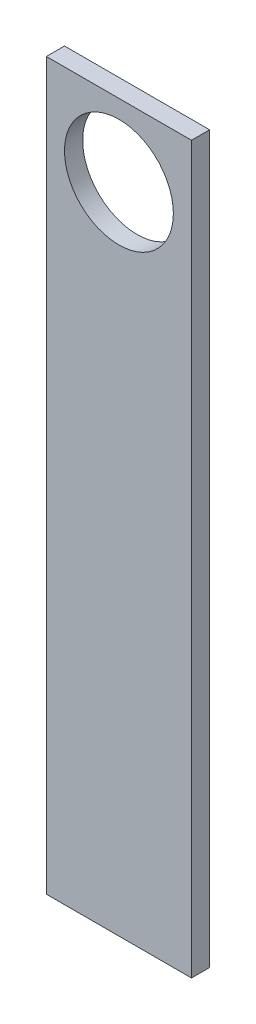
ISO-10303-21;
HEADER;
FILE_DESCRIPTION(('STEP AP214'),'2;1');
FILE_NAME('part.step','',(''),(''),'','','');
FILE_SCHEMA(('AUTOMOTIVE_DESIGN { 1 0 10303 214 1 1 1 1 }'));
ENDSEC;
DATA;
#1=APPLICATION_CONTEXT('core data for automotive mechanical design processes');
#2=APPLICATION_PROTOCOL_DEFINITION('international standard','automotive_design',2000,#1);
#3=PRODUCT_CONTEXT('',#1,'mechanical');
#4=PRODUCT('Part','Part','',(#3));
#5=PRODUCT_RELATED_PRODUCT_CATEGORY('part','',(#4));
#6=PRODUCT_DEFINITION_FORMATION('','',#4);
#7=PRODUCT_DEFINITION_CONTEXT('part definition',#1,'design');
#8=PRODUCT_DEFINITION('design','',#6,#7);
#9=PRODUCT_DEFINITION_SHAPE('','',#8);
#10=(LENGTH_UNIT() NAMED_UNIT(*) SI_UNIT(.MILLI.,.METRE.));
#11=(NAMED_UNIT(*) PLANE_ANGLE_UNIT() SI_UNIT($,.RADIAN.));
#12=(NAMED_UNIT(*) SI_UNIT($,.STERADIAN.) SOLID_ANGLE_UNIT());
#13=UNCERTAINTY_MEASURE_WITH_UNIT(LENGTH_MEASURE(1.E-05),#10,'distance_accuracy_value','');
#14=(GEOMETRIC_REPRESENTATION_CONTEXT(3) GLOBAL_UNCERTAINTY_ASSIGNED_CONTEXT((#13)) GLOBAL_UNIT_ASSIGNED_CONTEXT((#10,
#11,#12)) REPRESENTATION_CONTEXT('',''));
#15=CARTESIAN_POINT('',(0.,0.,0.));
#16=DIRECTION('',(0.,0.,1.));
#17=DIRECTION('',(1.,0.,0.));
#18=AXIS2_PLACEMENT_3D('',#15,#16,#17);
#19=CARTESIAN_POINT('',(-21.2550284629981,17.0136622390892,3.175));
#20=DIRECTION('',(1.,0.,0.));
#21=DIRECTION('',(0.,1.,0.));
#22=AXIS2_PLACEMENT_3D('',#19,#20,#21);
#23=PLANE('',#22);
#24=DIRECTION('',(0.,-1.,0.));
#25=VECTOR('',#24,1.);
#26=CARTESIAN_POINT('',(-21.2550284629981,17.0136622390892,0.));
#27=LINE('',#26,#25);
#28=CARTESIAN_POINT('',(-21.2550284629981,17.0136622390892,0.));
#29=VERTEX_POINT('',#28);
#30=CARTESIAN_POINT('',(-21.2550284629981,-109.986337760911,0.));
#31=VERTEX_POINT('',#30);
#32=EDGE_CURVE('E106',#29,#31,#27,.T.);
#33=ORIENTED_EDGE('',*,*,#32,.T.);
#34=DIRECTION('',(0.,0.,-1.));
#35=VECTOR('',#34,1.);
#36=CARTESIAN_POINT('',(-21.2550284629981,-109.986337760911,3.175));
#37=LINE('',#36,#35);
#38=CARTESIAN_POINT('',(-21.2550284629981,-109.986337760911,3.175));
#39=VERTEX_POINT('',#38);
#40=EDGE_CURVE('E11',#39,#31,#37,.T.);
#41=ORIENTED_EDGE('',*,*,#40,.F.);
#42=DIRECTION('',(0.,-1.,0.));
#43=VECTOR('',#42,1.);
#44=CARTESIAN_POINT('',(-21.2550284629981,17.0136622390892,3.175));
#45=LINE('',#44,#43);
#46=CARTESIAN_POINT('',(-21.2550284629981,17.0136622390892,3.175));
#47=VERTEX_POINT('',#46);
#48=EDGE_CURVE('E90',#47,#39,#45,.T.);
#49=ORIENTED_EDGE('',*,*,#48,.F.);
#50=DIRECTION('',(0.,0.,-1.));
#51=VECTOR('',#50,1.);
#52=CARTESIAN_POINT('',(-21.2550284629981,17.0136622390892,3.175));
#53=LINE('',#52,#51);
#54=EDGE_CURVE('E102',#47,#29,#53,.T.);
#55=ORIENTED_EDGE('',*,*,#54,.T.);
#56=EDGE_LOOP('',(#33,#41,#49,#55));
#57=FACE_BOUND('',#56,.T.);
#58=ADVANCED_FACE('F38',(#57),#23,.F.);
#59=CARTESIAN_POINT('',(-21.2550284629981,-109.986337760911,3.175));
#60=DIRECTION('',(0.,1.,0.));
#61=DIRECTION('',(0.,0.,1.));
#62=AXIS2_PLACEMENT_3D('',#59,#60,#61);
#63=PLANE('',#62);
#64=DIRECTION('',(1.,0.,0.));
#65=VECTOR('',#64,1.);
#66=CARTESIAN_POINT('',(-21.2550284629981,-109.986337760911,0.));
#67=LINE('',#66,#65);
#68=CARTESIAN_POINT('',(4.14497153700191,-109.986337760911,0.));
#69=VERTEX_POINT('',#68);
#70=EDGE_CURVE('E95',#31,#69,#67,.T.);
#71=ORIENTED_EDGE('',*,*,#70,.T.);
#72=DIRECTION('',(0.,0.,-1.));
#73=VECTOR('',#72,1.);
#74=CARTESIAN_POINT('',(4.14497153700191,-109.986337760911,3.175));
#75=LINE('',#74,#73);
#76=CARTESIAN_POINT('',(4.14497153700191,-109.986337760911,3.175));
#77=VERTEX_POINT('',#76);
#78=EDGE_CURVE('E47',#77,#69,#75,.T.);
#79=ORIENTED_EDGE('',*,*,#78,.F.);
#80=DIRECTION('',(1.,0.,0.));
#81=VECTOR('',#80,1.);
#82=CARTESIAN_POINT('',(-21.2550284629981,-109.986337760911,3.175));
#83=LINE('',#82,#81);
#84=EDGE_CURVE('E85',#39,#77,#83,.T.);
#85=ORIENTED_EDGE('',*,*,#84,.F.);
#86=ORIENTED_EDGE('',*,*,#40,.T.);
#87=EDGE_LOOP('',(#71,#79,#85,#86));
#88=FACE_BOUND('',#87,.T.);
#89=ADVANCED_FACE('F94',(#88),#63,.F.);
#90=CARTESIAN_POINT('',(4.1449715370019,17.0136622390892,3.175));
#91=DIRECTION('',(-1.,0.,0.));
#92=DIRECTION('',(0.,-1.,0.));
#93=AXIS2_PLACEMENT_3D('',#90,#91,#92);
#94=PLANE('',#93);
#95=DIRECTION('',(0.,1.,0.));
#96=VECTOR('',#95,1.);
#97=CARTESIAN_POINT('',(4.1449715370019,17.0136622390892,0.));
#98=LINE('',#97,#96);
#99=CARTESIAN_POINT('',(4.1449715370019,17.0136622390892,0.));
#100=VERTEX_POINT('',#99);
#101=EDGE_CURVE('E72',#69,#100,#98,.T.);
#102=ORIENTED_EDGE('',*,*,#101,.T.);
#103=DIRECTION('',(0.,0.,-1.));
#104=VECTOR('',#103,1.);
#105=CARTESIAN_POINT('',(4.1449715370019,17.0136622390892,3.175));
#106=LINE('',#105,#104);
#107=CARTESIAN_POINT('',(4.1449715370019,17.0136622390892,3.175));
#108=VERTEX_POINT('',#107);
#109=EDGE_CURVE('E97',#108,#100,#106,.T.);
#110=ORIENTED_EDGE('',*,*,#109,.F.);
#111=DIRECTION('',(0.,1.,0.));
#112=VECTOR('',#111,1.);
#113=CARTESIAN_POINT('',(4.1449715370019,17.0136622390892,3.175));
#114=LINE('',#113,#112);
#115=EDGE_CURVE('E88',#77,#108,#114,.T.);
#116=ORIENTED_EDGE('',*,*,#115,.F.);
#117=ORIENTED_EDGE('',*,*,#78,.T.);
#118=EDGE_LOOP('',(#102,#110,#116,#117));
#119=FACE_BOUND('',#118,.T.);
#120=ADVANCED_FACE('F98',(#119),#94,.F.);
#121=CARTESIAN_POINT('',(-21.2550284629981,17.0136622390892,3.175));
#122=DIRECTION('',(0.,-1.,0.));
#123=DIRECTION('',(0.,0.,-1.));
#124=AXIS2_PLACEMENT_3D('',#121,#122,#123);
#125=PLANE('',#124);
#126=DIRECTION('',(-1.,0.,0.));
#127=VECTOR('',#126,1.);
#128=CARTESIAN_POINT('',(-21.2550284629981,17.0136622390892,0.));
#129=LINE('',#128,#127);
#130=EDGE_CURVE('E78',#100,#29,#129,.T.);
#131=ORIENTED_EDGE('',*,*,#130,.T.);
#132=ORIENTED_EDGE('',*,*,#54,.F.);
#133=DIRECTION('',(-1.,0.,0.));
#134=VECTOR('',#133,1.);
#135=CARTESIAN_POINT('',(-21.2550284629981,17.0136622390892,3.175));
#136=LINE('',#135,#134);
#137=EDGE_CURVE('E55',#108,#47,#136,.T.);
#138=ORIENTED_EDGE('',*,*,#137,.F.);
#139=ORIENTED_EDGE('',*,*,#109,.T.);
#140=EDGE_LOOP('',(#131,#132,#138,#139));
#141=FACE_BOUND('',#140,.T.);
#142=ADVANCED_FACE('F120',(#141),#125,.F.);
#143=CARTESIAN_POINT('',(0.,0.,3.175));
#144=DIRECTION('',(0.,0.,1.));
#145=DIRECTION('',(1.,0.,0.));
#146=AXIS2_PLACEMENT_3D('',#143,#144,#145);
#147=PLANE('',#146);
#148=CARTESIAN_POINT('',(-8.5550284629981,4.31366223908918,3.175));
#149=DIRECTION('',(0.,0.,1.));
#150=DIRECTION('',(1.,0.,0.));
#151=AXIS2_PLACEMENT_3D('',#148,#149,#150);
#152=CIRCLE('',#151,9.525);
#153=CARTESIAN_POINT('',(0.969971537001896,4.31366223908918,3.175));
#154=VERTEX_POINT('',#153);
#155=EDGE_CURVE('E127',#154,#154,#152,.T.);
#156=ORIENTED_EDGE('',*,*,#155,.F.);
#157=EDGE_LOOP('',(#156));
#158=FACE_BOUND('',#157,.T.);
#159=ORIENTED_EDGE('',*,*,#48,.T.);
#160=ORIENTED_EDGE('',*,*,#84,.T.);
#161=ORIENTED_EDGE('',*,*,#115,.T.);
#162=ORIENTED_EDGE('',*,*,#137,.T.);
#163=EDGE_LOOP('',(#159,#160,#161,#162));
#164=FACE_BOUND('',#163,.T.);
#165=ADVANCED_FACE('F86',(#158,#164),#147,.T.);
#166=CARTESIAN_POINT('',(0.,0.,0.));
#167=DIRECTION('',(0.,0.,1.));
#168=DIRECTION('',(1.,0.,0.));
#169=AXIS2_PLACEMENT_3D('',#166,#167,#168);
#170=PLANE('',#169);
#171=CARTESIAN_POINT('',(-8.5550284629981,4.31366223908918,0.));
#172=DIRECTION('',(0.,0.,1.));
#173=DIRECTION('',(1.,0.,0.));
#174=AXIS2_PLACEMENT_3D('',#171,#172,#173);
#175=CIRCLE('',#174,9.525);
#176=CARTESIAN_POINT('',(0.969971537001896,4.31366223908918,0.));
#177=VERTEX_POINT('',#176);
#178=EDGE_CURVE('E110',#177,#177,#175,.T.);
#179=ORIENTED_EDGE('',*,*,#178,.T.);
#180=EDGE_LOOP('',(#179));
#181=FACE_BOUND('',#180,.T.);
#182=ORIENTED_EDGE('',*,*,#32,.F.);
#183=ORIENTED_EDGE('',*,*,#130,.F.);
#184=ORIENTED_EDGE('',*,*,#101,.F.);
#185=ORIENTED_EDGE('',*,*,#70,.F.);
#186=EDGE_LOOP('',(#182,#183,#184,#185));
#187=FACE_BOUND('',#186,.T.);
#188=ADVANCED_FACE('F123',(#181,#187),#170,.F.);
#189=CARTESIAN_POINT('',(-8.5550284629981,4.31366223908918,0.));
#190=DIRECTION('',(0.,0.,1.));
#191=DIRECTION('',(1.,0.,0.));
#192=AXIS2_PLACEMENT_3D('',#189,#190,#191);
#193=CYLINDRICAL_SURFACE('',#192,9.525);
#194=ORIENTED_EDGE('',*,*,#178,.F.);
#195=EDGE_LOOP('',(#194));
#196=FACE_BOUND('',#195,.T.);
#197=ORIENTED_EDGE('',*,*,#155,.T.);
#198=EDGE_LOOP('',(#197));
#199=FACE_BOUND('',#198,.T.);
#200=ADVANCED_FACE('F136',(#196,#199),#193,.F.);
#201=CLOSED_SHELL('',(#58,#89,#120,#142,#165,#188,#200));
#202=MANIFOLD_SOLID_BREP('B2',#201);
#203=ADVANCED_BREP_SHAPE_REPRESENTATION('',(#18,#202),#14);
#204=SHAPE_DEFINITION_REPRESENTATION(#9,#203);
ENDSEC;
END-ISO-10303-21;
